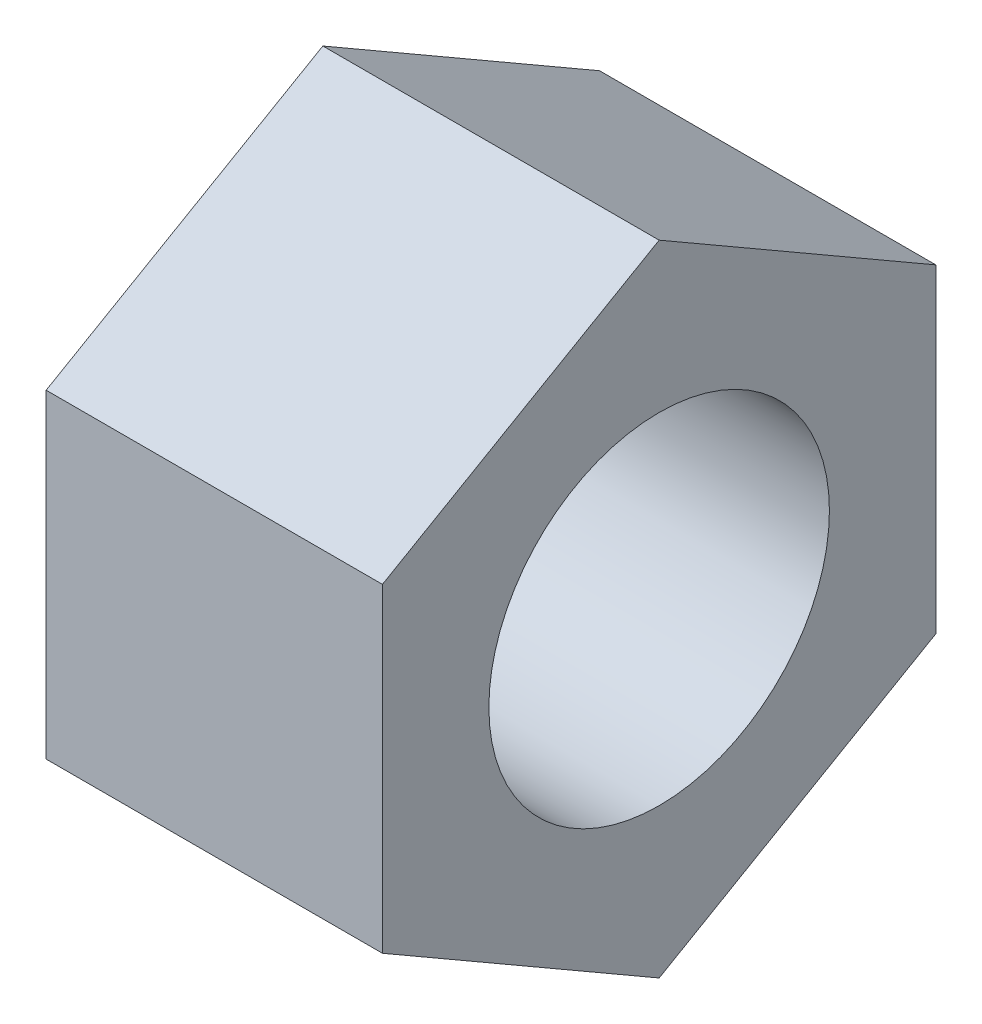
ISO-10303-21;
HEADER;
FILE_DESCRIPTION(('STEP AP214'),'2;1');
FILE_NAME('part.step','',(''),(''),'','','');
FILE_SCHEMA(('AUTOMOTIVE_DESIGN { 1 0 10303 214 1 1 1 1 }'));
ENDSEC;
DATA;
#1=APPLICATION_CONTEXT('core data for automotive mechanical design processes');
#2=APPLICATION_PROTOCOL_DEFINITION('international standard','automotive_design',2000,#1);
#3=PRODUCT_CONTEXT('',#1,'mechanical');
#4=PRODUCT('Part','Part','',(#3));
#5=PRODUCT_RELATED_PRODUCT_CATEGORY('part','',(#4));
#6=PRODUCT_DEFINITION_FORMATION('','',#4);
#7=PRODUCT_DEFINITION_CONTEXT('part definition',#1,'design');
#8=PRODUCT_DEFINITION('design','',#6,#7);
#9=PRODUCT_DEFINITION_SHAPE('','',#8);
#10=(LENGTH_UNIT() NAMED_UNIT(*) SI_UNIT(.MILLI.,.METRE.));
#11=(NAMED_UNIT(*) PLANE_ANGLE_UNIT() SI_UNIT($,.RADIAN.));
#12=(NAMED_UNIT(*) SI_UNIT($,.STERADIAN.) SOLID_ANGLE_UNIT());
#13=UNCERTAINTY_MEASURE_WITH_UNIT(LENGTH_MEASURE(1.E-05),#10,'distance_accuracy_value','');
#14=(GEOMETRIC_REPRESENTATION_CONTEXT(3) GLOBAL_UNCERTAINTY_ASSIGNED_CONTEXT((#13)) GLOBAL_UNIT_ASSIGNED_CONTEXT((#10,
#11,#12)) REPRESENTATION_CONTEXT('',''));
#15=CARTESIAN_POINT('',(0.,0.,0.));
#16=DIRECTION('',(0.,0.,1.));
#17=DIRECTION('',(1.,0.,0.));
#18=AXIS2_PLACEMENT_3D('',#15,#16,#17);
#19=CARTESIAN_POINT('',(7.9,0.,0.));
#20=DIRECTION('',(1.,0.,0.));
#21=DIRECTION('',(0.,0.,-1.));
#22=AXIS2_PLACEMENT_3D('',#19,#20,#21);
#23=PLANE('',#22);
#24=DIRECTION('',(0.,0.499999999999995,0.866025403784441));
#25=VECTOR('',#24,1.);
#26=CARTESIAN_POINT('',(7.9,3.75277674973265,-6.49999999999996));
#27=LINE('',#26,#25);
#28=CARTESIAN_POINT('',(7.9,3.75277674973265,-6.49999999999996));
#29=VERTEX_POINT('',#28);
#30=CARTESIAN_POINT('',(7.9,7.50555349946514,0.));
#31=VERTEX_POINT('',#30);
#32=EDGE_CURVE('E134',#29,#31,#27,.T.);
#33=ORIENTED_EDGE('',*,*,#32,.T.);
#34=DIRECTION('',(0.,-0.500000000000001,0.866025403784438));
#35=VECTOR('',#34,1.);
#36=CARTESIAN_POINT('',(7.9,7.50555349946514,0.));
#37=LINE('',#36,#35);
#38=CARTESIAN_POINT('',(7.9,3.75277674973256,6.50000000000001));
#39=VERTEX_POINT('',#38);
#40=EDGE_CURVE('E93',#31,#39,#37,.T.);
#41=ORIENTED_EDGE('',*,*,#40,.T.);
#42=DIRECTION('',(0.,-1.,0.));
#43=VECTOR('',#42,1.);
#44=CARTESIAN_POINT('',(7.9,3.75277674973256,6.50000000000001));
#45=LINE('',#44,#43);
#46=CARTESIAN_POINT('',(7.9,-3.7527767497326,6.49999999999999));
#47=VERTEX_POINT('',#46);
#48=EDGE_CURVE('E106',#39,#47,#45,.T.);
#49=ORIENTED_EDGE('',*,*,#48,.T.);
#50=DIRECTION('',(0.,-0.499999999999995,-0.866025403784442));
#51=VECTOR('',#50,1.);
#52=CARTESIAN_POINT('',(7.9,-3.7527767497326,6.49999999999999));
#53=LINE('',#52,#51);
#54=CARTESIAN_POINT('',(7.9,-7.50555349946514,0.));
#55=VERTEX_POINT('',#54);
#56=EDGE_CURVE('E99',#47,#55,#53,.T.);
#57=ORIENTED_EDGE('',*,*,#56,.T.);
#58=DIRECTION('',(0.,0.500000000000007,-0.866025403784435));
#59=VECTOR('',#58,1.);
#60=CARTESIAN_POINT('',(7.9,-7.50555349946514,0.));
#61=LINE('',#60,#59);
#62=CARTESIAN_POINT('',(7.9,-3.75277674973251,-6.50000000000004));
#63=VERTEX_POINT('',#62);
#64=EDGE_CURVE('E101',#55,#63,#61,.T.);
#65=ORIENTED_EDGE('',*,*,#64,.T.);
#66=DIRECTION('',(0.,1.,0.));
#67=VECTOR('',#66,1.);
#68=CARTESIAN_POINT('',(7.9,-3.75277674973251,-6.50000000000004));
#69=LINE('',#68,#67);
#70=EDGE_CURVE('E57',#63,#29,#69,.T.);
#71=ORIENTED_EDGE('',*,*,#70,.T.);
#72=EDGE_LOOP('',(#33,#41,#49,#57,#65,#71));
#73=FACE_BOUND('',#72,.T.);
#74=CARTESIAN_POINT('',(7.9,0.,0.));
#75=DIRECTION('',(1.,0.,0.));
#76=DIRECTION('',(0.,0.,-1.));
#77=AXIS2_PLACEMENT_3D('',#74,#75,#76);
#78=CIRCLE('',#77,4.);
#79=CARTESIAN_POINT('',(7.9,0.,-4.));
#80=VERTEX_POINT('',#79);
#81=EDGE_CURVE('E126',#80,#80,#78,.T.);
#82=ORIENTED_EDGE('',*,*,#81,.F.);
#83=EDGE_LOOP('',(#82));
#84=FACE_BOUND('',#83,.T.);
#85=ADVANCED_FACE('F39',(#73,#84),#23,.T.);
#86=CARTESIAN_POINT('',(0.,0.,0.));
#87=DIRECTION('',(1.,0.,0.));
#88=DIRECTION('',(0.,0.,-1.));
#89=AXIS2_PLACEMENT_3D('',#86,#87,#88);
#90=PLANE('',#89);
#91=DIRECTION('',(0.,0.499999999999995,0.866025403784441));
#92=VECTOR('',#91,1.);
#93=CARTESIAN_POINT('',(0.,3.75277674973265,-6.49999999999996));
#94=LINE('',#93,#92);
#95=CARTESIAN_POINT('',(0.,3.75277674973265,-6.49999999999996));
#96=VERTEX_POINT('',#95);
#97=CARTESIAN_POINT('',(0.,7.50555349946514,0.));
#98=VERTEX_POINT('',#97);
#99=EDGE_CURVE('E125',#96,#98,#94,.T.);
#100=ORIENTED_EDGE('',*,*,#99,.F.);
#101=DIRECTION('',(0.,1.,0.));
#102=VECTOR('',#101,1.);
#103=CARTESIAN_POINT('',(0.,-3.75277674973251,-6.50000000000004));
#104=LINE('',#103,#102);
#105=CARTESIAN_POINT('',(0.,-3.75277674973251,-6.50000000000004));
#106=VERTEX_POINT('',#105);
#107=EDGE_CURVE('E82',#106,#96,#104,.T.);
#108=ORIENTED_EDGE('',*,*,#107,.F.);
#109=DIRECTION('',(0.,0.500000000000007,-0.866025403784435));
#110=VECTOR('',#109,1.);
#111=CARTESIAN_POINT('',(0.,-7.50555349946514,0.));
#112=LINE('',#111,#110);
#113=CARTESIAN_POINT('',(0.,-7.50555349946514,0.));
#114=VERTEX_POINT('',#113);
#115=EDGE_CURVE('E80',#114,#106,#112,.T.);
#116=ORIENTED_EDGE('',*,*,#115,.F.);
#117=DIRECTION('',(0.,-0.499999999999995,-0.866025403784442));
#118=VECTOR('',#117,1.);
#119=CARTESIAN_POINT('',(0.,-3.7527767497326,6.49999999999999));
#120=LINE('',#119,#118);
#121=CARTESIAN_POINT('',(0.,-3.7527767497326,6.49999999999999));
#122=VERTEX_POINT('',#121);
#123=EDGE_CURVE('E114',#122,#114,#120,.T.);
#124=ORIENTED_EDGE('',*,*,#123,.F.);
#125=DIRECTION('',(0.,-1.,0.));
#126=VECTOR('',#125,1.);
#127=CARTESIAN_POINT('',(0.,3.75277674973256,6.50000000000001));
#128=LINE('',#127,#126);
#129=CARTESIAN_POINT('',(0.,3.75277674973256,6.50000000000001));
#130=VERTEX_POINT('',#129);
#131=EDGE_CURVE('E127',#130,#122,#128,.T.);
#132=ORIENTED_EDGE('',*,*,#131,.F.);
#133=DIRECTION('',(0.,-0.500000000000001,0.866025403784438));
#134=VECTOR('',#133,1.);
#135=CARTESIAN_POINT('',(0.,7.50555349946514,0.));
#136=LINE('',#135,#134);
#137=EDGE_CURVE('E130',#98,#130,#136,.T.);
#138=ORIENTED_EDGE('',*,*,#137,.F.);
#139=EDGE_LOOP('',(#100,#108,#116,#124,#132,#138));
#140=FACE_BOUND('',#139,.T.);
#141=CARTESIAN_POINT('',(0.,0.,0.));
#142=DIRECTION('',(1.,0.,0.));
#143=DIRECTION('',(0.,0.,-1.));
#144=AXIS2_PLACEMENT_3D('',#141,#142,#143);
#145=CIRCLE('',#144,4.);
#146=CARTESIAN_POINT('',(0.,0.,-4.));
#147=VERTEX_POINT('',#146);
#148=EDGE_CURVE('E228',#147,#147,#145,.T.);
#149=ORIENTED_EDGE('',*,*,#148,.T.);
#150=EDGE_LOOP('',(#149));
#151=FACE_BOUND('',#150,.T.);
#152=ADVANCED_FACE('F143',(#140,#151),#90,.F.);
#153=CARTESIAN_POINT('',(7.9,3.75277674973265,-6.49999999999996));
#154=DIRECTION('',(0.,-0.866025403784442,0.499999999999995));
#155=DIRECTION('',(0.,-0.499999999999995,-0.866025403784442));
#156=AXIS2_PLACEMENT_3D('',#153,#154,#155);
#157=PLANE('',#156);
#158=ORIENTED_EDGE('',*,*,#99,.T.);
#159=DIRECTION('',(-1.,0.,0.));
#160=VECTOR('',#159,1.);
#161=CARTESIAN_POINT('',(7.9,7.50555349946514,0.));
#162=LINE('',#161,#160);
#163=EDGE_CURVE('E11',#31,#98,#162,.T.);
#164=ORIENTED_EDGE('',*,*,#163,.F.);
#165=ORIENTED_EDGE('',*,*,#32,.F.);
#166=DIRECTION('',(-1.,0.,0.));
#167=VECTOR('',#166,1.);
#168=CARTESIAN_POINT('',(7.9,3.75277674973265,-6.49999999999996));
#169=LINE('',#168,#167);
#170=EDGE_CURVE('E120',#29,#96,#169,.T.);
#171=ORIENTED_EDGE('',*,*,#170,.T.);
#172=EDGE_LOOP('',(#158,#164,#165,#171));
#173=FACE_BOUND('',#172,.T.);
#174=ADVANCED_FACE('F41',(#173),#157,.F.);
#175=CARTESIAN_POINT('',(7.9,7.50555349946514,0.));
#176=DIRECTION('',(0.,-0.866025403784438,-0.500000000000001));
#177=DIRECTION('',(0.,0.500000000000001,-0.866025403784438));
#178=AXIS2_PLACEMENT_3D('',#175,#176,#177);
#179=PLANE('',#178);
#180=ORIENTED_EDGE('',*,*,#137,.T.);
#181=DIRECTION('',(-1.,0.,0.));
#182=VECTOR('',#181,1.);
#183=CARTESIAN_POINT('',(7.9,3.75277674973256,6.50000000000001));
#184=LINE('',#183,#182);
#185=EDGE_CURVE('E48',#39,#130,#184,.T.);
#186=ORIENTED_EDGE('',*,*,#185,.F.);
#187=ORIENTED_EDGE('',*,*,#40,.F.);
#188=ORIENTED_EDGE('',*,*,#163,.T.);
#189=EDGE_LOOP('',(#180,#186,#187,#188));
#190=FACE_BOUND('',#189,.T.);
#191=ADVANCED_FACE('F170',(#190),#179,.F.);
#192=CARTESIAN_POINT('',(7.9,3.75277674973256,6.50000000000001));
#193=DIRECTION('',(0.,0.,-1.));
#194=DIRECTION('',(0.,1.,0.));
#195=AXIS2_PLACEMENT_3D('',#192,#193,#194);
#196=PLANE('',#195);
#197=ORIENTED_EDGE('',*,*,#131,.T.);
#198=DIRECTION('',(-1.,0.,0.));
#199=VECTOR('',#198,1.);
#200=CARTESIAN_POINT('',(7.9,-3.7527767497326,6.49999999999999));
#201=LINE('',#200,#199);
#202=EDGE_CURVE('E113',#47,#122,#201,.T.);
#203=ORIENTED_EDGE('',*,*,#202,.F.);
#204=ORIENTED_EDGE('',*,*,#48,.F.);
#205=ORIENTED_EDGE('',*,*,#185,.T.);
#206=EDGE_LOOP('',(#197,#203,#204,#205));
#207=FACE_BOUND('',#206,.T.);
#208=ADVANCED_FACE('F141',(#207),#196,.F.);
#209=CARTESIAN_POINT('',(7.9,-3.7527767497326,6.49999999999999));
#210=DIRECTION('',(0.,0.866025403784442,-0.499999999999995));
#211=DIRECTION('',(0.,0.499999999999995,0.866025403784442));
#212=AXIS2_PLACEMENT_3D('',#209,#210,#211);
#213=PLANE('',#212);
#214=ORIENTED_EDGE('',*,*,#123,.T.);
#215=DIRECTION('',(-1.,0.,0.));
#216=VECTOR('',#215,1.);
#217=CARTESIAN_POINT('',(7.9,-7.50555349946514,0.));
#218=LINE('',#217,#216);
#219=EDGE_CURVE('E112',#55,#114,#218,.T.);
#220=ORIENTED_EDGE('',*,*,#219,.F.);
#221=ORIENTED_EDGE('',*,*,#56,.F.);
#222=ORIENTED_EDGE('',*,*,#202,.T.);
#223=EDGE_LOOP('',(#214,#220,#221,#222));
#224=FACE_BOUND('',#223,.T.);
#225=ADVANCED_FACE('F115',(#224),#213,.F.);
#226=CARTESIAN_POINT('',(7.9,-7.50555349946514,0.));
#227=DIRECTION('',(0.,0.866025403784435,0.500000000000007));
#228=DIRECTION('',(0.,-0.500000000000007,0.866025403784435));
#229=AXIS2_PLACEMENT_3D('',#226,#227,#228);
#230=PLANE('',#229);
#231=ORIENTED_EDGE('',*,*,#115,.T.);
#232=DIRECTION('',(-1.,0.,0.));
#233=VECTOR('',#232,1.);
#234=CARTESIAN_POINT('',(7.9,-3.75277674973251,-6.50000000000004));
#235=LINE('',#234,#233);
#236=EDGE_CURVE('E116',#63,#106,#235,.T.);
#237=ORIENTED_EDGE('',*,*,#236,.F.);
#238=ORIENTED_EDGE('',*,*,#64,.F.);
#239=ORIENTED_EDGE('',*,*,#219,.T.);
#240=EDGE_LOOP('',(#231,#237,#238,#239));
#241=FACE_BOUND('',#240,.T.);
#242=ADVANCED_FACE('F119',(#241),#230,.F.);
#243=CARTESIAN_POINT('',(7.9,-3.75277674973251,-6.50000000000004));
#244=DIRECTION('',(0.,0.,1.));
#245=DIRECTION('',(0.,-1.,0.));
#246=AXIS2_PLACEMENT_3D('',#243,#244,#245);
#247=PLANE('',#246);
#248=ORIENTED_EDGE('',*,*,#107,.T.);
#249=ORIENTED_EDGE('',*,*,#170,.F.);
#250=ORIENTED_EDGE('',*,*,#70,.F.);
#251=ORIENTED_EDGE('',*,*,#236,.T.);
#252=EDGE_LOOP('',(#248,#249,#250,#251));
#253=FACE_BOUND('',#252,.T.);
#254=ADVANCED_FACE('F146',(#253),#247,.F.);
#255=CARTESIAN_POINT('',(7.9,0.,0.));
#256=DIRECTION('',(-1.,0.,0.));
#257=DIRECTION('',(0.,0.,1.));
#258=AXIS2_PLACEMENT_3D('',#255,#256,#257);
#259=CYLINDRICAL_SURFACE('',#258,4.);
#260=ORIENTED_EDGE('',*,*,#81,.T.);
#261=EDGE_LOOP('',(#260));
#262=FACE_BOUND('',#261,.T.);
#263=ORIENTED_EDGE('',*,*,#148,.F.);
#264=EDGE_LOOP('',(#263));
#265=FACE_BOUND('',#264,.T.);
#266=ADVANCED_FACE('F151',(#262,#265),#259,.F.);
#267=CLOSED_SHELL('',(#85,#152,#174,#191,#208,#225,#242,#254,#266));
#268=MANIFOLD_SOLID_BREP('B2',#267);
#269=ADVANCED_BREP_SHAPE_REPRESENTATION('',(#18,#268),#14);
#270=SHAPE_DEFINITION_REPRESENTATION(#9,#269);
ENDSEC;
END-ISO-10303-21;
